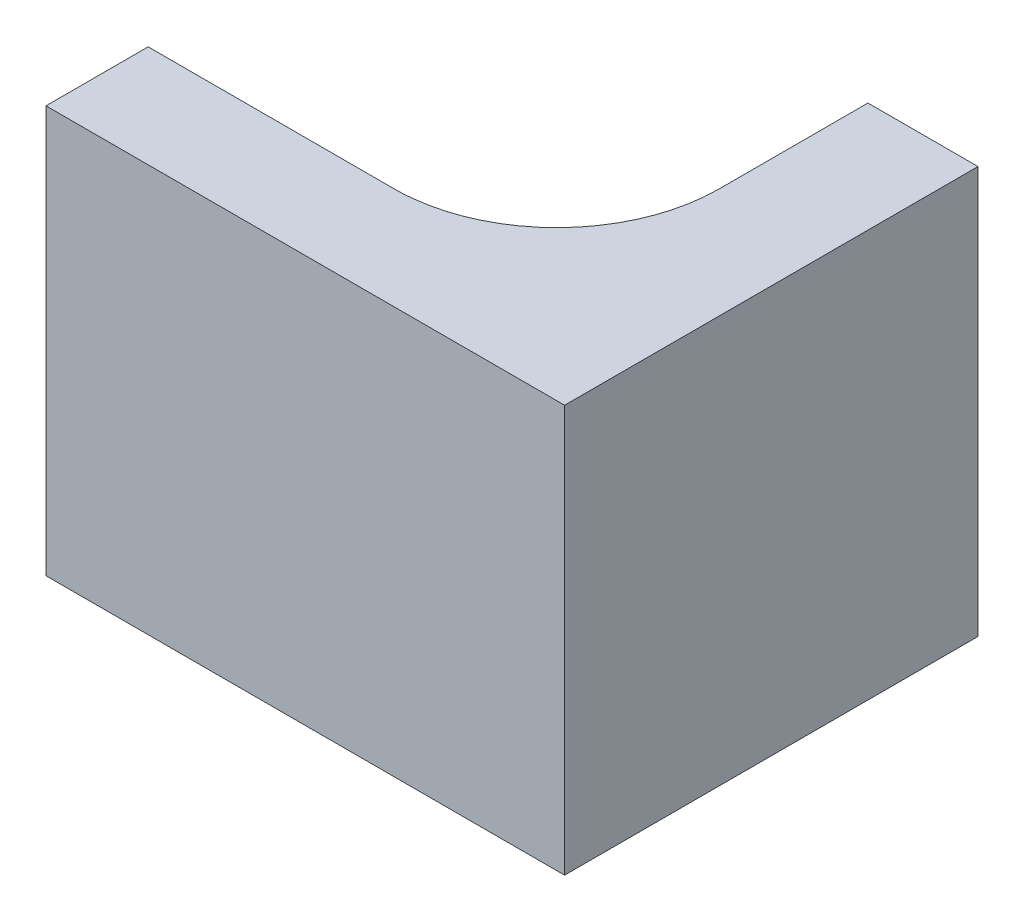
ISO-10303-21;
HEADER;
FILE_DESCRIPTION(('STEP AP214'),'2;1');
FILE_NAME('part.step','',(''),(''),'','','');
FILE_SCHEMA(('AUTOMOTIVE_DESIGN { 1 0 10303 214 1 1 1 1 }'));
ENDSEC;
DATA;
#1=APPLICATION_CONTEXT('core data for automotive mechanical design processes');
#2=APPLICATION_PROTOCOL_DEFINITION('international standard','automotive_design',2000,#1);
#3=PRODUCT_CONTEXT('',#1,'mechanical');
#4=PRODUCT('Part','Part','',(#3));
#5=PRODUCT_RELATED_PRODUCT_CATEGORY('part','',(#4));
#6=PRODUCT_DEFINITION_FORMATION('','',#4);
#7=PRODUCT_DEFINITION_CONTEXT('part definition',#1,'design');
#8=PRODUCT_DEFINITION('design','',#6,#7);
#9=PRODUCT_DEFINITION_SHAPE('','',#8);
#10=(LENGTH_UNIT() NAMED_UNIT(*) SI_UNIT(.MILLI.,.METRE.));
#11=(NAMED_UNIT(*) PLANE_ANGLE_UNIT() SI_UNIT($,.RADIAN.));
#12=(NAMED_UNIT(*) SI_UNIT($,.STERADIAN.) SOLID_ANGLE_UNIT());
#13=UNCERTAINTY_MEASURE_WITH_UNIT(LENGTH_MEASURE(1.E-05),#10,'distance_accuracy_value','');
#14=(GEOMETRIC_REPRESENTATION_CONTEXT(3) GLOBAL_UNCERTAINTY_ASSIGNED_CONTEXT((#13)) GLOBAL_UNIT_ASSIGNED_CONTEXT((#10,
#11,#12)) REPRESENTATION_CONTEXT('',''));
#15=CARTESIAN_POINT('',(0.,0.,0.));
#16=DIRECTION('',(0.,0.,1.));
#17=DIRECTION('',(1.,0.,0.));
#18=AXIS2_PLACEMENT_3D('',#15,#16,#17);
#19=CARTESIAN_POINT('',(0.,50.,-12.5523255813954));
#20=DIRECTION('',(1.,0.,0.));
#21=DIRECTION('',(0.,0.,-1.));
#22=AXIS2_PLACEMENT_3D('',#19,#20,#21);
#23=PLANE('',#22);
#24=DIRECTION('',(0.,0.,1.));
#25=VECTOR('',#24,1.);
#26=CARTESIAN_POINT('',(0.,0.,-12.5523255813954));
#27=LINE('',#26,#25);
#28=CARTESIAN_POINT('',(0.,0.,-12.5523255813954));
#29=VERTEX_POINT('',#28);
#30=CARTESIAN_POINT('',(0.,0.,0.));
#31=VERTEX_POINT('',#30);
#32=EDGE_CURVE('E131',#29,#31,#27,.T.);
#33=ORIENTED_EDGE('',*,*,#32,.T.);
#34=DIRECTION('',(0.,-1.,0.));
#35=VECTOR('',#34,1.);
#36=CARTESIAN_POINT('',(0.,50.,0.));
#37=LINE('',#36,#35);
#38=CARTESIAN_POINT('',(0.,50.,0.));
#39=VERTEX_POINT('',#38);
#40=EDGE_CURVE('E118',#39,#31,#37,.T.);
#41=ORIENTED_EDGE('',*,*,#40,.F.);
#42=DIRECTION('',(0.,0.,1.));
#43=VECTOR('',#42,1.);
#44=CARTESIAN_POINT('',(0.,50.,-12.5523255813954));
#45=LINE('',#44,#43);
#46=CARTESIAN_POINT('',(0.,50.,-12.5523255813954));
#47=VERTEX_POINT('',#46);
#48=EDGE_CURVE('E124',#47,#39,#45,.T.);
#49=ORIENTED_EDGE('',*,*,#48,.F.);
#50=DIRECTION('',(0.,-1.,0.));
#51=VECTOR('',#50,1.);
#52=CARTESIAN_POINT('',(0.,50.,-12.5523255813954));
#53=LINE('',#52,#51);
#54=EDGE_CURVE('E243',#47,#29,#53,.T.);
#55=ORIENTED_EDGE('',*,*,#54,.T.);
#56=EDGE_LOOP('',(#33,#41,#49,#55));
#57=FACE_BOUND('',#56,.T.);
#58=ADVANCED_FACE('F42',(#57),#23,.F.);
#59=CARTESIAN_POINT('',(0.,50.,0.));
#60=DIRECTION('',(0.,0.,-1.));
#61=DIRECTION('',(-1.,0.,0.));
#62=AXIS2_PLACEMENT_3D('',#59,#60,#61);
#63=PLANE('',#62);
#64=DIRECTION('',(1.,0.,0.));
#65=VECTOR('',#64,1.);
#66=CARTESIAN_POINT('',(0.,0.,0.));
#67=LINE('',#66,#65);
#68=CARTESIAN_POINT('',(63.7102627024139,0.,0.));
#69=VERTEX_POINT('',#68);
#70=EDGE_CURVE('E250',#31,#69,#67,.T.);
#71=ORIENTED_EDGE('',*,*,#70,.T.);
#72=DIRECTION('',(0.,-1.,0.));
#73=VECTOR('',#72,1.);
#74=CARTESIAN_POINT('',(63.7102627024139,50.,0.));
#75=LINE('',#74,#73);
#76=CARTESIAN_POINT('',(63.7102627024139,50.,0.));
#77=VERTEX_POINT('',#76);
#78=EDGE_CURVE('E120',#77,#69,#75,.T.);
#79=ORIENTED_EDGE('',*,*,#78,.F.);
#80=DIRECTION('',(1.,0.,0.));
#81=VECTOR('',#80,1.);
#82=CARTESIAN_POINT('',(0.,50.,0.));
#83=LINE('',#82,#81);
#84=EDGE_CURVE('E115',#39,#77,#83,.T.);
#85=ORIENTED_EDGE('',*,*,#84,.F.);
#86=ORIENTED_EDGE('',*,*,#40,.T.);
#87=EDGE_LOOP('',(#71,#79,#85,#86));
#88=FACE_BOUND('',#87,.T.);
#89=ADVANCED_FACE('F111',(#88),#63,.F.);
#90=CARTESIAN_POINT('',(63.7102627024139,50.,0.));
#91=DIRECTION('',(-1.,0.,0.));
#92=DIRECTION('',(0.,0.,1.));
#93=AXIS2_PLACEMENT_3D('',#90,#91,#92);
#94=PLANE('',#93);
#95=DIRECTION('',(0.,0.,-1.));
#96=VECTOR('',#95,1.);
#97=CARTESIAN_POINT('',(63.7102627024139,0.,0.));
#98=LINE('',#97,#96);
#99=CARTESIAN_POINT('',(63.7102627024139,0.,-50.7886404293381));
#100=VERTEX_POINT('',#99);
#101=EDGE_CURVE('E252',#69,#100,#98,.T.);
#102=ORIENTED_EDGE('',*,*,#101,.T.);
#103=DIRECTION('',(0.,-1.,0.));
#104=VECTOR('',#103,1.);
#105=CARTESIAN_POINT('',(63.7102627024139,50.,-50.7886404293381));
#106=LINE('',#105,#104);
#107=CARTESIAN_POINT('',(63.7102627024139,50.,-50.7886404293381));
#108=VERTEX_POINT('',#107);
#109=EDGE_CURVE('E140',#108,#100,#106,.T.);
#110=ORIENTED_EDGE('',*,*,#109,.F.);
#111=DIRECTION('',(0.,0.,-1.));
#112=VECTOR('',#111,1.);
#113=CARTESIAN_POINT('',(63.7102627024139,50.,0.));
#114=LINE('',#113,#112);
#115=EDGE_CURVE('E122',#77,#108,#114,.T.);
#116=ORIENTED_EDGE('',*,*,#115,.F.);
#117=ORIENTED_EDGE('',*,*,#78,.T.);
#118=EDGE_LOOP('',(#102,#110,#116,#117));
#119=FACE_BOUND('',#118,.T.);
#120=ADVANCED_FACE('F175',(#119),#94,.F.);
#121=CARTESIAN_POINT('',(63.7102627024139,50.,-50.7886404293381));
#122=DIRECTION('',(0.,0.,1.));
#123=DIRECTION('',(1.,0.,0.));
#124=AXIS2_PLACEMENT_3D('',#121,#122,#123);
#125=PLANE('',#124);
#126=DIRECTION('',(-1.,0.,0.));
#127=VECTOR('',#126,1.);
#128=CARTESIAN_POINT('',(63.7102627024139,0.,-50.7886404293381));
#129=LINE('',#128,#127);
#130=CARTESIAN_POINT('',(50.1923736147573,0.,-50.7886404293381));
#131=VERTEX_POINT('',#130);
#132=EDGE_CURVE('E255',#100,#131,#129,.T.);
#133=ORIENTED_EDGE('',*,*,#132,.T.);
#134=DIRECTION('',(0.,-1.,0.));
#135=VECTOR('',#134,1.);
#136=CARTESIAN_POINT('',(50.1923736147573,50.,-50.7886404293381));
#137=LINE('',#136,#135);
#138=CARTESIAN_POINT('',(50.1923736147573,50.,-50.7886404293381));
#139=VERTEX_POINT('',#138);
#140=EDGE_CURVE('E242',#139,#131,#137,.T.);
#141=ORIENTED_EDGE('',*,*,#140,.F.);
#142=DIRECTION('',(-1.,0.,0.));
#143=VECTOR('',#142,1.);
#144=CARTESIAN_POINT('',(63.7102627024139,50.,-50.7886404293381));
#145=LINE('',#144,#143);
#146=EDGE_CURVE('E241',#108,#139,#145,.T.);
#147=ORIENTED_EDGE('',*,*,#146,.F.);
#148=ORIENTED_EDGE('',*,*,#109,.T.);
#149=EDGE_LOOP('',(#133,#141,#147,#148));
#150=FACE_BOUND('',#149,.T.);
#151=ADVANCED_FACE('F173',(#150),#125,.F.);
#152=CARTESIAN_POINT('',(50.1923736147573,50.,-50.7886404293381));
#153=DIRECTION('',(1.,0.,0.));
#154=DIRECTION('',(0.,0.,-1.));
#155=AXIS2_PLACEMENT_3D('',#152,#153,#154);
#156=PLANE('',#155);
#157=DIRECTION('',(0.,0.,1.));
#158=VECTOR('',#157,1.);
#159=CARTESIAN_POINT('',(50.1923736147573,0.,-50.7886404293381));
#160=LINE('',#159,#158);
#161=CARTESIAN_POINT('',(50.1923736147573,0.,-22.5523255813953));
#162=VERTEX_POINT('',#161);
#163=EDGE_CURVE('E258',#131,#162,#160,.T.);
#164=ORIENTED_EDGE('',*,*,#163,.T.);
#165=CARTESIAN_POINT('',(50.1923736147569,150.000000000001,-32.5523255813953));
#166=CARTESIAN_POINT('',(50.1923736147571,118.333333333334,-32.5523255813953));
#167=CARTESIAN_POINT('',(50.1923736147572,86.6666666666669,-32.5523255813953));
#168=CARTESIAN_POINT('',(50.1923736147573,55.,-32.5523255813953));
#169=CARTESIAN_POINT('',(50.1923736147574,53.3333333333334,-32.5523255813953));
#170=CARTESIAN_POINT('',(50.1923736147574,51.6666666666667,-32.5523255813954));
#171=CARTESIAN_POINT('',(50.1923736147574,50.0000000000001,-32.5523255813954));
#172=CARTESIAN_POINT('',(50.1923736147574,33.3333333333333,-32.5523255813954));
#173=CARTESIAN_POINT('',(50.1923736147574,16.6666666666668,-22.5523255813954));
#174=CARTESIAN_POINT('',(50.1923736147574,0.,-22.5523255813953));
#175=CARTESIAN_POINT('',(50.1923736147574,-1.66666666666668,-22.5523255813953));
#176=CARTESIAN_POINT('',(50.1923736147574,-3.33333333333334,-22.5523255813953));
#177=CARTESIAN_POINT('',(50.1923736147573,-5.,-22.5523255813953));
#178=CARTESIAN_POINT('',(50.1923736147573,-36.6666666666671,-22.5523255813953));
#179=CARTESIAN_POINT('',(50.1923736147573,-68.3333333333342,-22.5523255813953));
#180=CARTESIAN_POINT('',(50.1923736147572,-100.000000000001,-22.5523255813953));
#181=(BOUNDED_CURVE() B_SPLINE_CURVE(3,(#165,#166,#167,#168,#169,#170,#171,#172,#173,#174,#175,
#176,#177,#178,#179,#180),.UNSPECIFIED.,.F.,.F.) B_SPLINE_CURVE_WITH_KNOTS((4,3,3,3,3,4),
(-1.58333333333334,0.,0.0833333333333323,0.916666666666668,1.,2.58333333333334),
.UNSPECIFIED.) CURVE() GEOMETRIC_REPRESENTATION_ITEM() RATIONAL_B_SPLINE_CURVE((1.,1.,1.,1.,1.,
1.,1.,1.,1.,1.,1.,1.,1.,1.,1.,1.)) REPRESENTATION_ITEM(''));
#182=CARTESIAN_POINT('',(50.1923736147573,50.,-32.5523255813954));
#183=VERTEX_POINT('',#182);
#184=EDGE_CURVE('E69',#162,#183,#181,.F.);
#185=ORIENTED_EDGE('',*,*,#184,.T.);
#186=DIRECTION('',(0.,0.,1.));
#187=VECTOR('',#186,1.);
#188=CARTESIAN_POINT('',(50.1923736147573,50.,-50.7886404293381));
#189=LINE('',#188,#187);
#190=EDGE_CURVE('E238',#139,#183,#189,.T.);
#191=ORIENTED_EDGE('',*,*,#190,.F.);
#192=ORIENTED_EDGE('',*,*,#140,.T.);
#193=EDGE_LOOP('',(#164,#185,#191,#192));
#194=FACE_BOUND('',#193,.T.);
#195=ADVANCED_FACE('F170',(#194),#156,.F.);
#196=CARTESIAN_POINT('',(50.1923736147573,50.,-12.5523255813954));
#197=DIRECTION('',(0.,0.,1.));
#198=DIRECTION('',(1.,0.,0.));
#199=AXIS2_PLACEMENT_3D('',#196,#197,#198);
#200=PLANE('',#199);
#201=DIRECTION('',(-1.,0.,0.));
#202=VECTOR('',#201,1.);
#203=CARTESIAN_POINT('',(50.1923736147573,50.,-12.5523255813954));
#204=LINE('',#203,#202);
#205=CARTESIAN_POINT('',(30.1923736147574,50.,-12.5523255813954));
#206=VERTEX_POINT('',#205);
#207=EDGE_CURVE('E126',#206,#47,#204,.T.);
#208=ORIENTED_EDGE('',*,*,#207,.F.);
#209=CARTESIAN_POINT('',(30.1923736147569,150.000000000001,-12.5523255813953));
#210=CARTESIAN_POINT('',(30.1923736147571,118.333333333334,-12.5523255813953));
#211=CARTESIAN_POINT('',(30.1923736147572,86.6666666666668,-12.5523255813953));
#212=CARTESIAN_POINT('',(30.1923736147573,54.9999999999999,-12.5523255813953));
#213=CARTESIAN_POINT('',(30.1923736147574,53.3333333333333,-12.5523255813954));
#214=CARTESIAN_POINT('',(30.1923736147574,51.6666666666666,-12.5523255813954));
#215=CARTESIAN_POINT('',(30.1923736147574,50.,-12.5523255813954));
#216=CARTESIAN_POINT('',(30.1923736147574,33.3333333333332,-12.5523255813954));
#217=CARTESIAN_POINT('',(40.1923736147574,16.6666666666668,-12.5523255813954));
#218=CARTESIAN_POINT('',(40.1923736147574,0.,-12.5523255813953));
#219=CARTESIAN_POINT('',(40.1923736147574,-1.66666666666672,-12.5523255813953));
#220=CARTESIAN_POINT('',(40.1923736147573,-3.33333333333338,-12.5523255813953));
#221=CARTESIAN_POINT('',(40.1923736147573,-5.00000000000005,-12.5523255813953));
#222=CARTESIAN_POINT('',(40.1923736147573,-36.6666666666672,-12.5523255813953));
#223=CARTESIAN_POINT('',(40.1923736147573,-68.3333333333343,-12.5523255813953));
#224=CARTESIAN_POINT('',(40.1923736147572,-100.000000000001,-12.5523255813953));
#225=(BOUNDED_CURVE() B_SPLINE_CURVE(3,(#209,#210,#211,#212,#213,#214,#215,#216,#217,#218,#219,
#220,#221,#222,#223,#224),.UNSPECIFIED.,.F.,.F.) B_SPLINE_CURVE_WITH_KNOTS((4,3,3,3,3,4),
(-1.58333333333334,0.,0.0833333333333323,0.916666666666668,1.,2.58333333333334),
.UNSPECIFIED.) CURVE() GEOMETRIC_REPRESENTATION_ITEM() RATIONAL_B_SPLINE_CURVE((1.,1.,1.,1.,1.,
1.,1.,1.,1.,1.,1.,1.,1.,1.,1.,1.)) REPRESENTATION_ITEM(''));
#226=CARTESIAN_POINT('',(40.1923736147574,0.,-12.5523255813954));
#227=VERTEX_POINT('',#226);
#228=EDGE_CURVE('E136',#206,#227,#225,.T.);
#229=ORIENTED_EDGE('',*,*,#228,.T.);
#230=DIRECTION('',(-1.,0.,0.));
#231=VECTOR('',#230,1.);
#232=CARTESIAN_POINT('',(50.1923736147573,0.,-12.5523255813954));
#233=LINE('',#232,#231);
#234=EDGE_CURVE('E134',#227,#29,#233,.T.);
#235=ORIENTED_EDGE('',*,*,#234,.T.);
#236=ORIENTED_EDGE('',*,*,#54,.F.);
#237=EDGE_LOOP('',(#208,#229,#235,#236));
#238=FACE_BOUND('',#237,.T.);
#239=ADVANCED_FACE('F163',(#238),#200,.F.);
#240=CARTESIAN_POINT('',(0.,50.,0.));
#241=DIRECTION('',(0.,1.,0.));
#242=DIRECTION('',(0.,0.,1.));
#243=AXIS2_PLACEMENT_3D('',#240,#241,#242);
#244=PLANE('',#243);
#245=ORIENTED_EDGE('',*,*,#48,.T.);
#246=ORIENTED_EDGE('',*,*,#84,.T.);
#247=ORIENTED_EDGE('',*,*,#115,.T.);
#248=ORIENTED_EDGE('',*,*,#146,.T.);
#249=ORIENTED_EDGE('',*,*,#190,.T.);
#250=CARTESIAN_POINT('',(50.1923736147574,50.0000000000001,-32.5523255813954));
#251=CARTESIAN_POINT('',(50.1923855297016,50.,-32.1773089739126));
#252=CARTESIAN_POINT('',(50.181826247949,50.,-31.8022937185365));
#253=CARTESIAN_POINT('',(50.1396520761798,50.,-31.0534667200161));
#254=CARTESIAN_POINT('',(50.1080381856119,50.,-30.6796549205907));
#255=CARTESIAN_POINT('',(50.0238422623702,50.,-29.9344059789229));
#256=CARTESIAN_POINT('',(49.9712605764806,50.,-29.5629687975101));
#257=CARTESIAN_POINT('',(49.8453471687875,50.,-28.8239166390409));
#258=CARTESIAN_POINT('',(49.7720310422605,50.,-28.4562990037673));
#259=CARTESIAN_POINT('',(49.6048613292304,50.,-27.7257618833596));
#260=CARTESIAN_POINT('',(49.5110079608114,50.,-27.36284234838));
#261=CARTESIAN_POINT('',(49.3030710171837,50.,-26.6428691639337));
#262=CARTESIAN_POINT('',(49.1889875566614,50.,-26.2858154812256));
#263=CARTESIAN_POINT('',(48.8788443024093,50.0000000000001,-25.4016742235274));
#264=CARTESIAN_POINT('',(48.6703296603254,50.,-24.878905614725));
#265=CARTESIAN_POINT('',(48.2099485042573,50.,-23.8527121770653));
#266=CARTESIAN_POINT('',(47.9580762839261,50.,-23.3492899050861));
#267=CARTESIAN_POINT('',(47.5492170059297,50.,-22.6115457774847));
#268=CARTESIAN_POINT('',(47.4077457226412,50.,-22.3685148046975));
#269=CARTESIAN_POINT('',(47.1147281942879,50.,-21.8886996662736));
#270=CARTESIAN_POINT('',(46.9631847985021,50.,-21.6519137602357));
#271=CARTESIAN_POINT('',(46.4937459009167,50.,-20.9514144784299));
#272=CARTESIAN_POINT('',(46.1610179602063,50.,-20.4975167356686));
#273=CARTESIAN_POINT('',(45.4585565947669,50.,-19.6194262099465));
#274=CARTESIAN_POINT('',(45.0888235309584,50.,-19.1952331373369));
#275=CARTESIAN_POINT('',(44.3149265773227,50.,-18.3794802863007));
#276=CARTESIAN_POINT('',(43.9107625036657,50.,-17.9879206821286));
#277=CARTESIAN_POINT('',(43.0708066342544,50.,-17.2401666823831));
#278=CARTESIAN_POINT('',(42.6350084975799,50.,-16.8839794111226));
#279=CARTESIAN_POINT('',(41.7349583687956,50.,-16.2095918109373));
#280=CARTESIAN_POINT('',(41.2707068147018,50.,-15.8913908974672));
#281=CARTESIAN_POINT('',(40.3169645661407,50.,-15.2951823798544));
#282=CARTESIAN_POINT('',(39.8274695198646,50.,-15.0171817376042));
#283=CARTESIAN_POINT('',(38.8267601749862,50.,-14.5033998090197));
#284=CARTESIAN_POINT('',(38.3155445454192,50.,-14.2676211145346));
#285=CARTESIAN_POINT('',(37.2753362101562,50.,-13.8400909420512));
#286=CARTESIAN_POINT('',(36.7463524871468,50.,-13.6483175899819));
#287=CARTESIAN_POINT('',(35.6741886938923,50.,-13.3100406465252));
#288=CARTESIAN_POINT('',(35.1310120703334,50.,-13.1635261730119));
#289=CARTESIAN_POINT('',(34.222566099951,50.,-12.9591143328671));
#290=CARTESIAN_POINT('',(33.860199602677,50.,-12.8880598551037));
#291=CARTESIAN_POINT('',(33.132095557215,50.,-12.7661120919225));
#292=CARTESIAN_POINT('',(32.7663582700868,50.,-12.715217258392));
#293=CARTESIAN_POINT('',(32.0331800297069,50.,-12.6338101493004));
#294=CARTESIAN_POINT('',(31.6657424278216,50.,-12.6032676099822));
#295=CARTESIAN_POINT('',(30.9296625529112,50.,-12.5625178658585));
#296=CARTESIAN_POINT('',(30.5610200388121,50.,-12.5523150161894));
#297=CARTESIAN_POINT('',(30.1923736147574,50.,-12.5523255813954));
#298=B_SPLINE_CURVE_WITH_KNOTS('',3,(#250,#251,#252,#253,#254,#255,#256,#257,#258,#259,#260,
#261,#262,#263,#264,#265,#266,#267,#268,#269,#270,#271,#272,#273,#274,#275,#276,#277,#278,#279,
#280,#281,#282,#283,#284,#285,#286,#287,#288,#289,#290,#291,#292,#293,#294,#295,#296,#297),
.UNSPECIFIED.,.F.,.F.,(4,2,2,2,2,2,2,2,2,2,2,2,2,2,2,2,2,2,2,2,2,2,2,4),(0.,1.12489916292012,
2.249744931405,3.37457209694533,4.49855547079326,5.62252690969623,6.74649197690219,
8.43287492135585,10.1194799827794,10.9628867299406,11.806055894743,13.4922478741881,
15.1784234093748,16.8646079477431,18.5511314133114,20.2376289228128,21.9244181514651,
23.6113108904028,25.2973632874561,26.9830099709301,28.0902993177676,29.197503616423,
30.3030578119424,31.4088487034252),.UNSPECIFIED.);
#299=EDGE_CURVE('E12',#183,#206,#298,.T.);
#300=ORIENTED_EDGE('',*,*,#299,.T.);
#301=ORIENTED_EDGE('',*,*,#207,.T.);
#302=EDGE_LOOP('',(#245,#246,#247,#248,#249,#300,#301));
#303=FACE_BOUND('',#302,.T.);
#304=ADVANCED_FACE('F127',(#303),#244,.T.);
#305=CARTESIAN_POINT('',(0.,0.,0.));
#306=DIRECTION('',(0.,1.,0.));
#307=DIRECTION('',(0.,0.,1.));
#308=AXIS2_PLACEMENT_3D('',#305,#306,#307);
#309=PLANE('',#308);
#310=ORIENTED_EDGE('',*,*,#32,.F.);
#311=ORIENTED_EDGE('',*,*,#234,.F.);
#312=CARTESIAN_POINT('',(40.1923736147574,0.,-12.5523255813953));
#313=CARTESIAN_POINT('',(40.473634206128,0.,-12.5522953376133));
#314=CARTESIAN_POINT('',(40.754890453877,0.,-12.5641904401589));
#315=CARTESIAN_POINT('',(41.3153906268088,0.,-12.6116128971216));
#316=CARTESIAN_POINT('',(41.5946346478723,0.,-12.6471391179104));
#317=CARTESIAN_POINT('',(42.148924602401,0.,-12.7415697192233));
#318=CARTESIAN_POINT('',(42.4239735485787,0.,-12.800456414513));
#319=CARTESIAN_POINT('',(42.9681326464575,0.,-12.941179585584));
#320=CARTESIAN_POINT('',(43.2372428706104,0.,-13.0230157812163));
#321=CARTESIAN_POINT('',(43.7677426491154,0.,-13.2091038873199));
#322=CARTESIAN_POINT('',(44.0291284601716,0.,-13.3133664695238));
#323=CARTESIAN_POINT('',(44.5421922228047,0.,-13.5435446937196));
#324=CARTESIAN_POINT('',(44.7938699689149,0.,-13.6694607936908));
#325=CARTESIAN_POINT('',(45.2856767785892,0.,-13.9420242088934));
#326=CARTESIAN_POINT('',(45.525807961704,0.,-14.0886676996704));
#327=CARTESIAN_POINT('',(45.9928631019341,0.,-14.4016601228232));
#328=CARTESIAN_POINT('',(46.2197871301921,1.27160489831585E-13,-14.568008949038));
#329=CARTESIAN_POINT('',(46.6588147915402,1.26844835122746E-13,-14.9192290179076));
#330=CARTESIAN_POINT('',(46.8709185297546,0.,-15.1041001291563));
#331=CARTESIAN_POINT('',(47.2787997398562,0.,-15.49105165339));
#332=CARTESIAN_POINT('',(47.4745772113727,0.,-15.6931320667658));
#333=CARTESIAN_POINT('',(47.8484524140445,0.,-16.1131086999116));
#334=CARTESIAN_POINT('',(48.0265465364004,0.,-16.3310081323677));
#335=CARTESIAN_POINT('',(48.3637406634773,0.,-16.7810332119925));
#336=CARTESIAN_POINT('',(48.5228409604809,1.05310358829482E-13,-17.0131586401642));
#337=CARTESIAN_POINT('',(48.8209510264382,1.07038091220235E-13,-17.4900397486415));
#338=CARTESIAN_POINT('',(48.9599565292967,0.,-17.7347980959741));
#339=CARTESIAN_POINT('',(49.2168455668456,0.,-18.2351509029404));
#340=CARTESIAN_POINT('',(49.3347294531635,0.,-18.4907451820926));
#341=CARTESIAN_POINT('',(49.5484914992098,0.,-19.0108493612506));
#342=CARTESIAN_POINT('',(49.6443797385044,0.,-19.2753551135608));
#343=CARTESIAN_POINT('',(49.8135139546642,0.,-19.8113990780321));
#344=CARTESIAN_POINT('',(49.8867653743686,0.,-20.0829355826619));
#345=CARTESIAN_POINT('',(50.029476135867,0.,-20.717251996015));
#346=CARTESIAN_POINT('',(50.0905606699457,0.,-21.0819706534828));
#347=CARTESIAN_POINT('',(50.1516412461801,0.,-21.6319767011738));
#348=CARTESIAN_POINT('',(50.1669103872781,0.,-21.8157066545522));
#349=CARTESIAN_POINT('',(50.1872753440301,0.,-22.1837178678124));
#350=CARTESIAN_POINT('',(50.1923718066117,0.,-22.3679990918899));
#351=CARTESIAN_POINT('',(50.1923736147574,0.,-22.5523255813953));
#352=B_SPLINE_CURVE_WITH_KNOTS('',3,(#312,#313,#314,#315,#316,#317,#318,#319,#320,#321,#322,
#323,#324,#325,#326,#327,#328,#329,#330,#331,#332,#333,#334,#335,#336,#337,#338,#339,#340,#341,
#342,#343,#344,#345,#346,#347,#348,#349,#350,#351),.UNSPECIFIED.,.F.,.F.,(4,2,2,2,2,2,2,2,2,2,2,
2,2,2,2,2,2,2,2,4),(0.,0.843524225534221,1.68700798857624,2.52985440039549,3.37269052387661,
4.21592860686619,5.05918452682158,5.90228505847178,6.74538104819436,7.58847105701004,
8.43156108497184,9.27482281775599,10.1180715725067,10.9614990856436,11.804912556303,
12.6479387548296,13.4907620965666,14.5975846256286,15.1504384772058,15.7032571691341),.UNSPECIFIED.);
#353=EDGE_CURVE('E63',#227,#162,#352,.T.);
#354=ORIENTED_EDGE('',*,*,#353,.T.);
#355=ORIENTED_EDGE('',*,*,#163,.F.);
#356=ORIENTED_EDGE('',*,*,#132,.F.);
#357=ORIENTED_EDGE('',*,*,#101,.F.);
#358=ORIENTED_EDGE('',*,*,#70,.F.);
#359=EDGE_LOOP('',(#310,#311,#354,#355,#356,#357,#358));
#360=FACE_BOUND('',#359,.T.);
#361=ADVANCED_FACE('F157',(#360),#309,.F.);
#362=CARTESIAN_POINT('',(30.1923736147573,60.0000000000001,-12.5523255813953));
#363=CARTESIAN_POINT('',(30.1923736147573,58.3333333333334,-12.5523255813953));
#364=CARTESIAN_POINT('',(30.1923736147573,56.6666666666666,-12.5523255813953));
#365=CARTESIAN_POINT('',(30.1923736147573,54.9999999999999,-12.5523255813953));
#366=CARTESIAN_POINT('',(30.1923736147574,53.3333333333333,-12.5523255813954));
#367=CARTESIAN_POINT('',(30.1923736147574,51.6666666666666,-12.5523255813954));
#368=CARTESIAN_POINT('',(30.1923736147574,50.,-12.5523255813954));
#369=CARTESIAN_POINT('',(30.1923736147574,33.3333333333332,-12.5523255813954));
#370=CARTESIAN_POINT('',(40.1923736147574,16.6666666666668,-12.5523255813954));
#371=CARTESIAN_POINT('',(40.1923736147574,0.,-12.5523255813953));
#372=CARTESIAN_POINT('',(40.1923736147574,-1.66666666666672,-12.5523255813953));
#373=CARTESIAN_POINT('',(40.1923736147573,-3.33333333333338,-12.5523255813953));
#374=CARTESIAN_POINT('',(40.1923736147573,-5.00000000000005,-12.5523255813953));
#375=CARTESIAN_POINT('',(40.1923736147573,-6.66666666666675,-12.5523255813953));
#376=CARTESIAN_POINT('',(40.1923736147573,-8.33333333333346,-12.5523255813953));
#377=CARTESIAN_POINT('',(40.1923736147573,-10.0000000000002,-12.5523255813953));
#378=CARTESIAN_POINT('',(50.1923736147573,60.0000000000002,-12.5523255813953));
#379=CARTESIAN_POINT('',(50.1923736147573,58.3333333333334,-12.5523255813953));
#380=CARTESIAN_POINT('',(50.1923736147573,56.6666666666667,-12.5523255813953));
#381=CARTESIAN_POINT('',(50.1923736147574,55.,-12.5523255813953));
#382=CARTESIAN_POINT('',(50.1923736147574,53.3333333333334,-12.5523255813954));
#383=CARTESIAN_POINT('',(50.1923736147574,51.6666666666667,-12.5523255813954));
#384=CARTESIAN_POINT('',(50.1923736147574,50.0000000000001,-12.5523255813954));
#385=CARTESIAN_POINT('',(50.1923736147574,33.3333333333333,-12.5523255813954));
#386=CARTESIAN_POINT('',(50.1923736147574,16.6666666666668,-12.5523255813954));
#387=CARTESIAN_POINT('',(50.1923736147574,0.,-12.5523255813953));
#388=CARTESIAN_POINT('',(50.1923736147574,-1.66666666666668,-12.5523255813953));
#389=CARTESIAN_POINT('',(50.1923736147574,-3.33333333333334,-12.5523255813953));
#390=CARTESIAN_POINT('',(50.1923736147574,-5.,-12.5523255813953));
#391=CARTESIAN_POINT('',(50.1923736147574,-6.66666666666671,-12.5523255813953));
#392=CARTESIAN_POINT('',(50.1923736147574,-8.33333333333342,-12.5523255813953));
#393=CARTESIAN_POINT('',(50.1923736147574,-10.0000000000001,-12.5523255813953));
#394=CARTESIAN_POINT('',(50.1923736147573,60.0000000000002,-32.5523255813953));
#395=CARTESIAN_POINT('',(50.1923736147573,58.3333333333334,-32.5523255813953));
#396=CARTESIAN_POINT('',(50.1923736147573,56.6666666666667,-32.5523255813953));
#397=CARTESIAN_POINT('',(50.1923736147573,55.,-32.5523255813953));
#398=CARTESIAN_POINT('',(50.1923736147574,53.3333333333334,-32.5523255813953));
#399=CARTESIAN_POINT('',(50.1923736147574,51.6666666666667,-32.5523255813954));
#400=CARTESIAN_POINT('',(50.1923736147574,50.0000000000001,-32.5523255813954));
#401=CARTESIAN_POINT('',(50.1923736147574,33.3333333333333,-32.5523255813954));
#402=CARTESIAN_POINT('',(50.1923736147574,16.6666666666668,-22.5523255813954));
#403=CARTESIAN_POINT('',(50.1923736147574,0.,-22.5523255813953));
#404=CARTESIAN_POINT('',(50.1923736147574,-1.66666666666668,-22.5523255813953));
#405=CARTESIAN_POINT('',(50.1923736147574,-3.33333333333334,-22.5523255813953));
#406=CARTESIAN_POINT('',(50.1923736147573,-5.,-22.5523255813953));
#407=CARTESIAN_POINT('',(50.1923736147573,-6.66666666666671,-22.5523255813953));
#408=CARTESIAN_POINT('',(50.1923736147573,-8.33333333333341,-22.5523255813953));
#409=CARTESIAN_POINT('',(50.1923736147573,-10.0000000000001,-22.5523255813953));
#410=(BOUNDED_SURFACE() B_SPLINE_SURFACE(2,3,((#362,#363,#364,#365,#366,#367,#368,#369,#370,
#371,#372,#373,#374,#375,#376,#377),(#378,#379,#380,#381,#382,#383,#384,#385,#386,#387,#388,
#389,#390,#391,#392,#393),(#394,#395,#396,#397,#398,#399,#400,#401,#402,#403,#404,#405,#406,
#407,#408,#409)),.UNSPECIFIED.,.F.,.F.,.F.) B_SPLINE_SURFACE_WITH_KNOTS((3,3),(4,3,3,3,3,4),(0.,
1.),(-0.0833333333333357,0.,0.0833333333333323,0.916666666666668,1.,1.08333333333333),
.UNSPECIFIED.) GEOMETRIC_REPRESENTATION_ITEM() RATIONAL_B_SPLINE_SURFACE(((1.,1.,1.,1.,1.,1.,1.,
1.,1.,1.,1.,1.,1.,1.,1.,1.),(0.707106781186548,0.707106781186548,0.707106781186548,
0.707106781186548,0.707106781186548,0.707106781186548,0.707106781186548,0.707106781186548,
0.707106781186548,0.707106781186548,0.707106781186548,0.707106781186548,0.707106781186548,
0.707106781186548,0.707106781186548,0.707106781186548),(1.,1.,1.,1.,1.,1.,1.,1.,1.,1.,1.,1.,1.,
1.,1.,1.))) REPRESENTATION_ITEM('') SURFACE());
#411=ORIENTED_EDGE('',*,*,#299,.F.);
#412=ORIENTED_EDGE('',*,*,#184,.F.);
#413=ORIENTED_EDGE('',*,*,#353,.F.);
#414=ORIENTED_EDGE('',*,*,#228,.F.);
#415=EDGE_LOOP('',(#411,#412,#413,#414));
#416=FACE_BOUND('',#415,.T.);
#417=ADVANCED_FACE('F50',(#416),#410,.T.);
#418=CLOSED_SHELL('',(#58,#89,#120,#151,#195,#239,#304,#361,#417));
#419=MANIFOLD_SOLID_BREP('B2',#418);
#420=ADVANCED_BREP_SHAPE_REPRESENTATION('',(#18,#419),#14);
#421=SHAPE_DEFINITION_REPRESENTATION(#9,#420);
ENDSEC;
END-ISO-10303-21;
